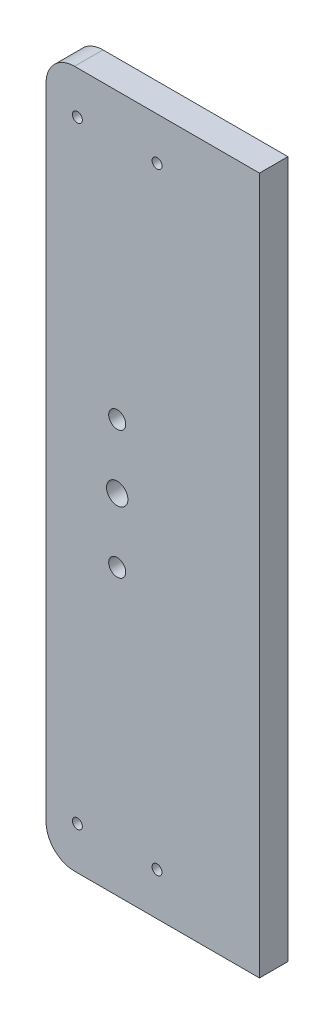
ISO-10303-21;
HEADER;
FILE_DESCRIPTION(('STEP AP214'),'2;1');
FILE_NAME('part.step','',(''),(''),'','','');
FILE_SCHEMA(('AUTOMOTIVE_DESIGN { 1 0 10303 214 1 1 1 1 }'));
ENDSEC;
DATA;
#1=APPLICATION_CONTEXT('core data for automotive mechanical design processes');
#2=APPLICATION_PROTOCOL_DEFINITION('international standard','automotive_design',2000,#1);
#3=PRODUCT_CONTEXT('',#1,'mechanical');
#4=PRODUCT('Part','Part','',(#3));
#5=PRODUCT_RELATED_PRODUCT_CATEGORY('part','',(#4));
#6=PRODUCT_DEFINITION_FORMATION('','',#4);
#7=PRODUCT_DEFINITION_CONTEXT('part definition',#1,'design');
#8=PRODUCT_DEFINITION('design','',#6,#7);
#9=PRODUCT_DEFINITION_SHAPE('','',#8);
#10=(LENGTH_UNIT() NAMED_UNIT(*) SI_UNIT(.MILLI.,.METRE.));
#11=(NAMED_UNIT(*) PLANE_ANGLE_UNIT() SI_UNIT($,.RADIAN.));
#12=(NAMED_UNIT(*) SI_UNIT($,.STERADIAN.) SOLID_ANGLE_UNIT());
#13=UNCERTAINTY_MEASURE_WITH_UNIT(LENGTH_MEASURE(1.E-05),#10,'distance_accuracy_value','');
#14=(GEOMETRIC_REPRESENTATION_CONTEXT(3) GLOBAL_UNCERTAINTY_ASSIGNED_CONTEXT((#13)) GLOBAL_UNIT_ASSIGNED_CONTEXT((#10,
#11,#12)) REPRESENTATION_CONTEXT('',''));
#15=CARTESIAN_POINT('',(0.,0.,0.));
#16=DIRECTION('',(0.,0.,1.));
#17=DIRECTION('',(1.,0.,0.));
#18=AXIS2_PLACEMENT_3D('',#15,#16,#17);
#19=CARTESIAN_POINT('',(0.,245.,20.));
#20=DIRECTION('',(0.,1.,0.));
#21=DIRECTION('',(0.,0.,1.));
#22=AXIS2_PLACEMENT_3D('',#19,#20,#21);
#23=PLANE('',#22);
#24=DIRECTION('',(1.,0.,0.));
#25=VECTOR('',#24,1.);
#26=CARTESIAN_POINT('',(0.,245.,0.));
#27=LINE('',#26,#25);
#28=CARTESIAN_POINT('',(-30.,245.,0.));
#29=VERTEX_POINT('',#28);
#30=CARTESIAN_POINT('',(100.,245.,0.));
#31=VERTEX_POINT('',#30);
#32=EDGE_CURVE('E138',#29,#31,#27,.T.);
#33=ORIENTED_EDGE('',*,*,#32,.F.);
#34=DIRECTION('',(0.,0.,-1.));
#35=VECTOR('',#34,1.);
#36=CARTESIAN_POINT('',(-30.,245.,20.));
#37=LINE('',#36,#35);
#38=CARTESIAN_POINT('',(-30.,245.,20.));
#39=VERTEX_POINT('',#38);
#40=EDGE_CURVE('E60',#29,#39,#37,.F.);
#41=ORIENTED_EDGE('',*,*,#40,.T.);
#42=DIRECTION('',(1.,0.,0.));
#43=VECTOR('',#42,1.);
#44=CARTESIAN_POINT('',(0.,245.,20.));
#45=LINE('',#44,#43);
#46=CARTESIAN_POINT('',(100.,245.,20.));
#47=VERTEX_POINT('',#46);
#48=EDGE_CURVE('E165',#39,#47,#45,.T.);
#49=ORIENTED_EDGE('',*,*,#48,.T.);
#50=DIRECTION('',(0.,0.,-1.));
#51=VECTOR('',#50,1.);
#52=CARTESIAN_POINT('',(100.,245.,20.));
#53=LINE('',#52,#51);
#54=EDGE_CURVE('E109',#47,#31,#53,.T.);
#55=ORIENTED_EDGE('',*,*,#54,.T.);
#56=EDGE_LOOP('',(#33,#41,#49,#55));
#57=FACE_BOUND('',#56,.T.);
#58=ADVANCED_FACE('F37',(#57),#23,.T.);
#59=CARTESIAN_POINT('',(-50.,0.,20.));
#60=DIRECTION('',(1.,0.,0.));
#61=DIRECTION('',(0.,0.,-1.));
#62=AXIS2_PLACEMENT_3D('',#59,#60,#61);
#63=PLANE('',#62);
#64=DIRECTION('',(0.,-1.,0.));
#65=VECTOR('',#64,1.);
#66=CARTESIAN_POINT('',(-50.,0.,20.));
#67=LINE('',#66,#65);
#68=CARTESIAN_POINT('',(-50.,225.,20.));
#69=VERTEX_POINT('',#68);
#70=CARTESIAN_POINT('',(-50.,-225.,20.));
#71=VERTEX_POINT('',#70);
#72=EDGE_CURVE('E98',#69,#71,#67,.T.);
#73=ORIENTED_EDGE('',*,*,#72,.F.);
#74=DIRECTION('',(0.,0.,-1.));
#75=VECTOR('',#74,1.);
#76=CARTESIAN_POINT('',(-50.,225.,0.));
#77=LINE('',#76,#75);
#78=CARTESIAN_POINT('',(-50.,225.,0.));
#79=VERTEX_POINT('',#78);
#80=EDGE_CURVE('E155',#69,#79,#77,.T.);
#81=ORIENTED_EDGE('',*,*,#80,.T.);
#82=DIRECTION('',(0.,-1.,0.));
#83=VECTOR('',#82,1.);
#84=CARTESIAN_POINT('',(-50.,0.,0.));
#85=LINE('',#84,#83);
#86=CARTESIAN_POINT('',(-50.,-225.,0.));
#87=VERTEX_POINT('',#86);
#88=EDGE_CURVE('E140',#79,#87,#85,.T.);
#89=ORIENTED_EDGE('',*,*,#88,.T.);
#90=DIRECTION('',(0.,0.,-1.));
#91=VECTOR('',#90,1.);
#92=CARTESIAN_POINT('',(-50.,-225.,20.));
#93=LINE('',#92,#91);
#94=EDGE_CURVE('E108',#87,#71,#93,.F.);
#95=ORIENTED_EDGE('',*,*,#94,.T.);
#96=EDGE_LOOP('',(#73,#81,#89,#95));
#97=FACE_BOUND('',#96,.T.);
#98=ADVANCED_FACE('F169',(#97),#63,.F.);
#99=CARTESIAN_POINT('',(0.,-245.,20.));
#100=DIRECTION('',(0.,1.,0.));
#101=DIRECTION('',(0.,0.,1.));
#102=AXIS2_PLACEMENT_3D('',#99,#100,#101);
#103=PLANE('',#102);
#104=DIRECTION('',(1.,0.,0.));
#105=VECTOR('',#104,1.);
#106=CARTESIAN_POINT('',(0.,-245.,20.));
#107=LINE('',#106,#105);
#108=CARTESIAN_POINT('',(-30.,-245.,20.));
#109=VERTEX_POINT('',#108);
#110=CARTESIAN_POINT('',(100.,-245.,20.));
#111=VERTEX_POINT('',#110);
#112=EDGE_CURVE('E90',#109,#111,#107,.T.);
#113=ORIENTED_EDGE('',*,*,#112,.F.);
#114=DIRECTION('',(0.,0.,-1.));
#115=VECTOR('',#114,1.);
#116=CARTESIAN_POINT('',(-30.,-245.,20.));
#117=LINE('',#116,#115);
#118=CARTESIAN_POINT('',(-30.,-245.,0.));
#119=VERTEX_POINT('',#118);
#120=EDGE_CURVE('E11',#109,#119,#117,.T.);
#121=ORIENTED_EDGE('',*,*,#120,.T.);
#122=DIRECTION('',(1.,0.,0.));
#123=VECTOR('',#122,1.);
#124=CARTESIAN_POINT('',(0.,-245.,0.));
#125=LINE('',#124,#123);
#126=CARTESIAN_POINT('',(100.,-245.,0.));
#127=VERTEX_POINT('',#126);
#128=EDGE_CURVE('E104',#119,#127,#125,.T.);
#129=ORIENTED_EDGE('',*,*,#128,.T.);
#130=DIRECTION('',(0.,0.,-1.));
#131=VECTOR('',#130,1.);
#132=CARTESIAN_POINT('',(100.,-245.,20.));
#133=LINE('',#132,#131);
#134=EDGE_CURVE('E101',#111,#127,#133,.T.);
#135=ORIENTED_EDGE('',*,*,#134,.F.);
#136=EDGE_LOOP('',(#113,#121,#129,#135));
#137=FACE_BOUND('',#136,.T.);
#138=ADVANCED_FACE('F102',(#137),#103,.F.);
#139=CARTESIAN_POINT('',(28.,-215.,20.));
#140=DIRECTION('',(0.,0.,-1.));
#141=DIRECTION('',(-1.,0.,0.));
#142=AXIS2_PLACEMENT_3D('',#139,#140,#141);
#143=CYLINDRICAL_SURFACE('',#142,3.5);
#144=CARTESIAN_POINT('',(28.,-215.,20.));
#145=DIRECTION('',(0.,0.,1.));
#146=DIRECTION('',(1.,0.,0.));
#147=AXIS2_PLACEMENT_3D('',#144,#145,#146);
#148=CIRCLE('',#147,3.5);
#149=CARTESIAN_POINT('',(31.5,-215.,20.));
#150=VERTEX_POINT('',#149);
#151=EDGE_CURVE('E114',#150,#150,#148,.T.);
#152=ORIENTED_EDGE('',*,*,#151,.T.);
#153=EDGE_LOOP('',(#152));
#154=FACE_BOUND('',#153,.T.);
#155=CARTESIAN_POINT('',(28.,-215.,0.));
#156=DIRECTION('',(0.,0.,1.));
#157=DIRECTION('',(1.,0.,0.));
#158=AXIS2_PLACEMENT_3D('',#155,#156,#157);
#159=CIRCLE('',#158,3.5);
#160=CARTESIAN_POINT('',(31.5,-215.,0.));
#161=VERTEX_POINT('',#160);
#162=EDGE_CURVE('E146',#161,#161,#159,.T.);
#163=ORIENTED_EDGE('',*,*,#162,.F.);
#164=EDGE_LOOP('',(#163));
#165=FACE_BOUND('',#164,.T.);
#166=ADVANCED_FACE('F239',(#154,#165),#143,.F.);
#167=CARTESIAN_POINT('',(100.,0.,20.));
#168=DIRECTION('',(1.,0.,0.));
#169=DIRECTION('',(0.,0.,-1.));
#170=AXIS2_PLACEMENT_3D('',#167,#168,#169);
#171=PLANE('',#170);
#172=DIRECTION('',(0.,-1.,0.));
#173=VECTOR('',#172,1.);
#174=CARTESIAN_POINT('',(100.,0.,0.));
#175=LINE('',#174,#173);
#176=EDGE_CURVE('E144',#31,#127,#175,.T.);
#177=ORIENTED_EDGE('',*,*,#176,.F.);
#178=ORIENTED_EDGE('',*,*,#54,.F.);
#179=DIRECTION('',(0.,-1.,0.));
#180=VECTOR('',#179,1.);
#181=CARTESIAN_POINT('',(100.,0.,20.));
#182=LINE('',#181,#180);
#183=EDGE_CURVE('E95',#47,#111,#182,.T.);
#184=ORIENTED_EDGE('',*,*,#183,.T.);
#185=ORIENTED_EDGE('',*,*,#134,.T.);
#186=EDGE_LOOP('',(#177,#178,#184,#185));
#187=FACE_BOUND('',#186,.T.);
#188=ADVANCED_FACE('F112',(#187),#171,.T.);
#189=CARTESIAN_POINT('',(-28.,215.,20.));
#190=DIRECTION('',(0.,0.,-1.));
#191=DIRECTION('',(-1.,0.,0.));
#192=AXIS2_PLACEMENT_3D('',#189,#190,#191);
#193=CYLINDRICAL_SURFACE('',#192,3.5);
#194=CARTESIAN_POINT('',(-28.,215.,20.));
#195=DIRECTION('',(0.,0.,1.));
#196=DIRECTION('',(1.,0.,0.));
#197=AXIS2_PLACEMENT_3D('',#194,#195,#196);
#198=CIRCLE('',#197,3.5);
#199=CARTESIAN_POINT('',(-24.5,215.,20.));
#200=VERTEX_POINT('',#199);
#201=EDGE_CURVE('E353',#200,#200,#198,.T.);
#202=ORIENTED_EDGE('',*,*,#201,.T.);
#203=EDGE_LOOP('',(#202));
#204=FACE_BOUND('',#203,.T.);
#205=CARTESIAN_POINT('',(-28.,215.,0.));
#206=DIRECTION('',(0.,0.,1.));
#207=DIRECTION('',(1.,0.,0.));
#208=AXIS2_PLACEMENT_3D('',#205,#206,#207);
#209=CIRCLE('',#208,3.5);
#210=CARTESIAN_POINT('',(-24.5,215.,0.));
#211=VERTEX_POINT('',#210);
#212=EDGE_CURVE('E135',#211,#211,#209,.T.);
#213=ORIENTED_EDGE('',*,*,#212,.F.);
#214=EDGE_LOOP('',(#213));
#215=FACE_BOUND('',#214,.T.);
#216=ADVANCED_FACE('F189',(#204,#215),#193,.F.);
#217=CARTESIAN_POINT('',(28.,215.,20.));
#218=DIRECTION('',(0.,0.,-1.));
#219=DIRECTION('',(-1.,0.,0.));
#220=AXIS2_PLACEMENT_3D('',#217,#218,#219);
#221=CYLINDRICAL_SURFACE('',#220,3.5);
#222=CARTESIAN_POINT('',(28.,215.,20.));
#223=DIRECTION('',(0.,0.,1.));
#224=DIRECTION('',(1.,0.,0.));
#225=AXIS2_PLACEMENT_3D('',#222,#223,#224);
#226=CIRCLE('',#225,3.5);
#227=CARTESIAN_POINT('',(31.5,215.,20.));
#228=VERTEX_POINT('',#227);
#229=EDGE_CURVE('E350',#228,#228,#226,.F.);
#230=ORIENTED_EDGE('',*,*,#229,.F.);
#231=EDGE_LOOP('',(#230));
#232=FACE_BOUND('',#231,.T.);
#233=CARTESIAN_POINT('',(28.,215.,0.));
#234=DIRECTION('',(0.,0.,1.));
#235=DIRECTION('',(1.,0.,0.));
#236=AXIS2_PLACEMENT_3D('',#233,#234,#235);
#237=CIRCLE('',#236,3.5);
#238=CARTESIAN_POINT('',(31.5,215.,0.));
#239=VERTEX_POINT('',#238);
#240=EDGE_CURVE('E132',#239,#239,#237,.F.);
#241=ORIENTED_EDGE('',*,*,#240,.T.);
#242=EDGE_LOOP('',(#241));
#243=FACE_BOUND('',#242,.T.);
#244=ADVANCED_FACE('F192',(#232,#243),#221,.F.);
#245=CARTESIAN_POINT('',(0.,0.,20.));
#246=DIRECTION('',(0.,0.,-1.));
#247=DIRECTION('',(-1.,0.,0.));
#248=AXIS2_PLACEMENT_3D('',#245,#246,#247);
#249=CYLINDRICAL_SURFACE('',#248,7.5);
#250=CARTESIAN_POINT('',(0.,0.,20.));
#251=DIRECTION('',(0.,0.,1.));
#252=DIRECTION('',(1.,0.,0.));
#253=AXIS2_PLACEMENT_3D('',#250,#251,#252);
#254=CIRCLE('',#253,7.5);
#255=CARTESIAN_POINT('',(7.5,0.,20.));
#256=VERTEX_POINT('',#255);
#257=EDGE_CURVE('E346',#256,#256,#254,.T.);
#258=ORIENTED_EDGE('',*,*,#257,.T.);
#259=EDGE_LOOP('',(#258));
#260=FACE_BOUND('',#259,.T.);
#261=CARTESIAN_POINT('',(0.,0.,0.));
#262=DIRECTION('',(0.,0.,1.));
#263=DIRECTION('',(1.,0.,0.));
#264=AXIS2_PLACEMENT_3D('',#261,#262,#263);
#265=CIRCLE('',#264,7.5);
#266=CARTESIAN_POINT('',(7.5,0.,0.));
#267=VERTEX_POINT('',#266);
#268=EDGE_CURVE('E129',#267,#267,#265,.T.);
#269=ORIENTED_EDGE('',*,*,#268,.F.);
#270=EDGE_LOOP('',(#269));
#271=FACE_BOUND('',#270,.T.);
#272=ADVANCED_FACE('F196',(#260,#271),#249,.F.);
#273=CARTESIAN_POINT('',(0.,45.,20.));
#274=DIRECTION('',(0.,0.,-1.));
#275=DIRECTION('',(-1.,0.,0.));
#276=AXIS2_PLACEMENT_3D('',#273,#274,#275);
#277=CYLINDRICAL_SURFACE('',#276,6.);
#278=CARTESIAN_POINT('',(0.,45.,20.));
#279=DIRECTION('',(0.,0.,1.));
#280=DIRECTION('',(1.,0.,0.));
#281=AXIS2_PLACEMENT_3D('',#278,#279,#280);
#282=CIRCLE('',#281,6.);
#283=CARTESIAN_POINT('',(6.,45.,20.));
#284=VERTEX_POINT('',#283);
#285=EDGE_CURVE('E342',#284,#284,#282,.T.);
#286=ORIENTED_EDGE('',*,*,#285,.T.);
#287=EDGE_LOOP('',(#286));
#288=FACE_BOUND('',#287,.T.);
#289=CARTESIAN_POINT('',(0.,45.,0.));
#290=DIRECTION('',(0.,0.,1.));
#291=DIRECTION('',(1.,0.,0.));
#292=AXIS2_PLACEMENT_3D('',#289,#290,#291);
#293=CIRCLE('',#292,6.);
#294=CARTESIAN_POINT('',(6.,45.,0.));
#295=VERTEX_POINT('',#294);
#296=EDGE_CURVE('E126',#295,#295,#293,.T.);
#297=ORIENTED_EDGE('',*,*,#296,.F.);
#298=EDGE_LOOP('',(#297));
#299=FACE_BOUND('',#298,.T.);
#300=ADVANCED_FACE('F200',(#288,#299),#277,.F.);
#301=CARTESIAN_POINT('',(0.,-45.,20.));
#302=DIRECTION('',(0.,0.,-1.));
#303=DIRECTION('',(-1.,0.,0.));
#304=AXIS2_PLACEMENT_3D('',#301,#302,#303);
#305=CYLINDRICAL_SURFACE('',#304,6.);
#306=CARTESIAN_POINT('',(0.,-45.,20.));
#307=DIRECTION('',(0.,0.,1.));
#308=DIRECTION('',(1.,0.,0.));
#309=AXIS2_PLACEMENT_3D('',#306,#307,#308);
#310=CIRCLE('',#309,6.);
#311=CARTESIAN_POINT('',(6.,-45.,20.));
#312=VERTEX_POINT('',#311);
#313=EDGE_CURVE('E152',#312,#312,#310,.T.);
#314=ORIENTED_EDGE('',*,*,#313,.T.);
#315=EDGE_LOOP('',(#314));
#316=FACE_BOUND('',#315,.T.);
#317=CARTESIAN_POINT('',(0.,-45.,0.));
#318=DIRECTION('',(0.,0.,1.));
#319=DIRECTION('',(1.,0.,0.));
#320=AXIS2_PLACEMENT_3D('',#317,#318,#319);
#321=CIRCLE('',#320,6.);
#322=CARTESIAN_POINT('',(6.,-45.,0.));
#323=VERTEX_POINT('',#322);
#324=EDGE_CURVE('E123',#323,#323,#321,.T.);
#325=ORIENTED_EDGE('',*,*,#324,.F.);
#326=EDGE_LOOP('',(#325));
#327=FACE_BOUND('',#326,.T.);
#328=ADVANCED_FACE('F204',(#316,#327),#305,.F.);
#329=CARTESIAN_POINT('',(-28.,-215.,20.));
#330=DIRECTION('',(0.,0.,-1.));
#331=DIRECTION('',(-1.,0.,0.));
#332=AXIS2_PLACEMENT_3D('',#329,#330,#331);
#333=CYLINDRICAL_SURFACE('',#332,3.49999999999999);
#334=CARTESIAN_POINT('',(-28.,-215.,20.));
#335=DIRECTION('',(0.,0.,1.));
#336=DIRECTION('',(1.,0.,0.));
#337=AXIS2_PLACEMENT_3D('',#334,#335,#336);
#338=CIRCLE('',#337,3.49999999999999);
#339=CARTESIAN_POINT('',(-24.5,-215.,20.));
#340=VERTEX_POINT('',#339);
#341=EDGE_CURVE('E117',#340,#340,#338,.F.);
#342=ORIENTED_EDGE('',*,*,#341,.F.);
#343=EDGE_LOOP('',(#342));
#344=FACE_BOUND('',#343,.T.);
#345=CARTESIAN_POINT('',(-28.,-215.,0.));
#346=DIRECTION('',(0.,0.,1.));
#347=DIRECTION('',(1.,0.,0.));
#348=AXIS2_PLACEMENT_3D('',#345,#346,#347);
#349=CIRCLE('',#348,3.49999999999999);
#350=CARTESIAN_POINT('',(-24.5,-215.,0.));
#351=VERTEX_POINT('',#350);
#352=EDGE_CURVE('E149',#351,#351,#349,.F.);
#353=ORIENTED_EDGE('',*,*,#352,.T.);
#354=EDGE_LOOP('',(#353));
#355=FACE_BOUND('',#354,.T.);
#356=ADVANCED_FACE('F207',(#344,#355),#333,.F.);
#357=CARTESIAN_POINT('',(0.,0.,20.));
#358=DIRECTION('',(0.,0.,1.));
#359=DIRECTION('',(1.,0.,0.));
#360=AXIS2_PLACEMENT_3D('',#357,#358,#359);
#361=PLANE('',#360);
#362=ORIENTED_EDGE('',*,*,#313,.F.);
#363=EDGE_LOOP('',(#362));
#364=FACE_BOUND('',#363,.T.);
#365=ORIENTED_EDGE('',*,*,#285,.F.);
#366=EDGE_LOOP('',(#365));
#367=FACE_BOUND('',#366,.T.);
#368=ORIENTED_EDGE('',*,*,#257,.F.);
#369=EDGE_LOOP('',(#368));
#370=FACE_BOUND('',#369,.T.);
#371=ORIENTED_EDGE('',*,*,#229,.T.);
#372=EDGE_LOOP('',(#371));
#373=FACE_BOUND('',#372,.T.);
#374=ORIENTED_EDGE('',*,*,#201,.F.);
#375=EDGE_LOOP('',(#374));
#376=FACE_BOUND('',#375,.T.);
#377=ORIENTED_EDGE('',*,*,#48,.F.);
#378=CARTESIAN_POINT('',(-30.,225.,20.));
#379=DIRECTION('',(0.,0.,1.));
#380=DIRECTION('',(1.,0.,0.));
#381=AXIS2_PLACEMENT_3D('',#378,#379,#380);
#382=CIRCLE('',#381,20.);
#383=EDGE_CURVE('E45',#39,#69,#382,.T.);
#384=ORIENTED_EDGE('',*,*,#383,.T.);
#385=ORIENTED_EDGE('',*,*,#72,.T.);
#386=CARTESIAN_POINT('',(-30.,-225.,20.));
#387=DIRECTION('',(0.,0.,1.));
#388=DIRECTION('',(1.,0.,0.));
#389=AXIS2_PLACEMENT_3D('',#386,#387,#388);
#390=CIRCLE('',#389,20.);
#391=EDGE_CURVE('E52',#71,#109,#390,.T.);
#392=ORIENTED_EDGE('',*,*,#391,.T.);
#393=ORIENTED_EDGE('',*,*,#112,.T.);
#394=ORIENTED_EDGE('',*,*,#183,.F.);
#395=EDGE_LOOP('',(#377,#384,#385,#392,#393,#394));
#396=FACE_BOUND('',#395,.T.);
#397=ORIENTED_EDGE('',*,*,#151,.F.);
#398=EDGE_LOOP('',(#397));
#399=FACE_BOUND('',#398,.T.);
#400=ORIENTED_EDGE('',*,*,#341,.T.);
#401=EDGE_LOOP('',(#400));
#402=FACE_BOUND('',#401,.T.);
#403=ADVANCED_FACE('F92',(#364,#367,#370,#373,#376,#396,#399,#402),#361,.T.);
#404=CARTESIAN_POINT('',(0.,0.,0.));
#405=DIRECTION('',(0.,0.,1.));
#406=DIRECTION('',(1.,0.,0.));
#407=AXIS2_PLACEMENT_3D('',#404,#405,#406);
#408=PLANE('',#407);
#409=ORIENTED_EDGE('',*,*,#324,.T.);
#410=EDGE_LOOP('',(#409));
#411=FACE_BOUND('',#410,.T.);
#412=ORIENTED_EDGE('',*,*,#296,.T.);
#413=EDGE_LOOP('',(#412));
#414=FACE_BOUND('',#413,.T.);
#415=ORIENTED_EDGE('',*,*,#268,.T.);
#416=EDGE_LOOP('',(#415));
#417=FACE_BOUND('',#416,.T.);
#418=ORIENTED_EDGE('',*,*,#240,.F.);
#419=EDGE_LOOP('',(#418));
#420=FACE_BOUND('',#419,.T.);
#421=ORIENTED_EDGE('',*,*,#212,.T.);
#422=EDGE_LOOP('',(#421));
#423=FACE_BOUND('',#422,.T.);
#424=ORIENTED_EDGE('',*,*,#88,.F.);
#425=CARTESIAN_POINT('',(-30.,225.,0.));
#426=DIRECTION('',(0.,0.,1.));
#427=DIRECTION('',(1.,0.,0.));
#428=AXIS2_PLACEMENT_3D('',#425,#426,#427);
#429=CIRCLE('',#428,20.);
#430=EDGE_CURVE('E160',#79,#29,#429,.F.);
#431=ORIENTED_EDGE('',*,*,#430,.T.);
#432=ORIENTED_EDGE('',*,*,#32,.T.);
#433=ORIENTED_EDGE('',*,*,#176,.T.);
#434=ORIENTED_EDGE('',*,*,#128,.F.);
#435=CARTESIAN_POINT('',(-30.,-225.,0.));
#436=DIRECTION('',(0.,0.,1.));
#437=DIRECTION('',(1.,0.,0.));
#438=AXIS2_PLACEMENT_3D('',#435,#436,#437);
#439=CIRCLE('',#438,20.);
#440=EDGE_CURVE('E158',#119,#87,#439,.F.);
#441=ORIENTED_EDGE('',*,*,#440,.T.);
#442=EDGE_LOOP('',(#424,#431,#432,#433,#434,#441));
#443=FACE_BOUND('',#442,.T.);
#444=ORIENTED_EDGE('',*,*,#162,.T.);
#445=EDGE_LOOP('',(#444));
#446=FACE_BOUND('',#445,.T.);
#447=ORIENTED_EDGE('',*,*,#352,.F.);
#448=EDGE_LOOP('',(#447));
#449=FACE_BOUND('',#448,.T.);
#450=ADVANCED_FACE('F174',(#411,#414,#417,#420,#423,#443,#446,#449),#408,.F.);
#451=CARTESIAN_POINT('',(-30.,225.,20.));
#452=DIRECTION('',(0.,0.,1.));
#453=DIRECTION('',(1.,0.,0.));
#454=AXIS2_PLACEMENT_3D('',#451,#452,#453);
#455=CYLINDRICAL_SURFACE('',#454,20.);
#456=ORIENTED_EDGE('',*,*,#383,.F.);
#457=ORIENTED_EDGE('',*,*,#40,.F.);
#458=ORIENTED_EDGE('',*,*,#430,.F.);
#459=ORIENTED_EDGE('',*,*,#80,.F.);
#460=EDGE_LOOP('',(#456,#457,#458,#459));
#461=FACE_BOUND('',#460,.T.);
#462=ADVANCED_FACE('F172',(#461),#455,.T.);
#463=CARTESIAN_POINT('',(-30.,-225.,20.));
#464=DIRECTION('',(0.,0.,-1.));
#465=DIRECTION('',(-1.,0.,0.));
#466=AXIS2_PLACEMENT_3D('',#463,#464,#465);
#467=CYLINDRICAL_SURFACE('',#466,20.);
#468=ORIENTED_EDGE('',*,*,#391,.F.);
#469=ORIENTED_EDGE('',*,*,#94,.F.);
#470=ORIENTED_EDGE('',*,*,#440,.F.);
#471=ORIENTED_EDGE('',*,*,#120,.F.);
#472=EDGE_LOOP('',(#468,#469,#470,#471));
#473=FACE_BOUND('',#472,.T.);
#474=ADVANCED_FACE('F39',(#473),#467,.T.);
#475=CLOSED_SHELL('',(#58,#98,#138,#166,#188,#216,#244,#272,#300,#328,#356,#403,#450,#462,#474));
#476=MANIFOLD_SOLID_BREP('B2',#475);
#477=ADVANCED_BREP_SHAPE_REPRESENTATION('',(#18,#476),#14);
#478=SHAPE_DEFINITION_REPRESENTATION(#9,#477);
ENDSEC;
END-ISO-10303-21;
